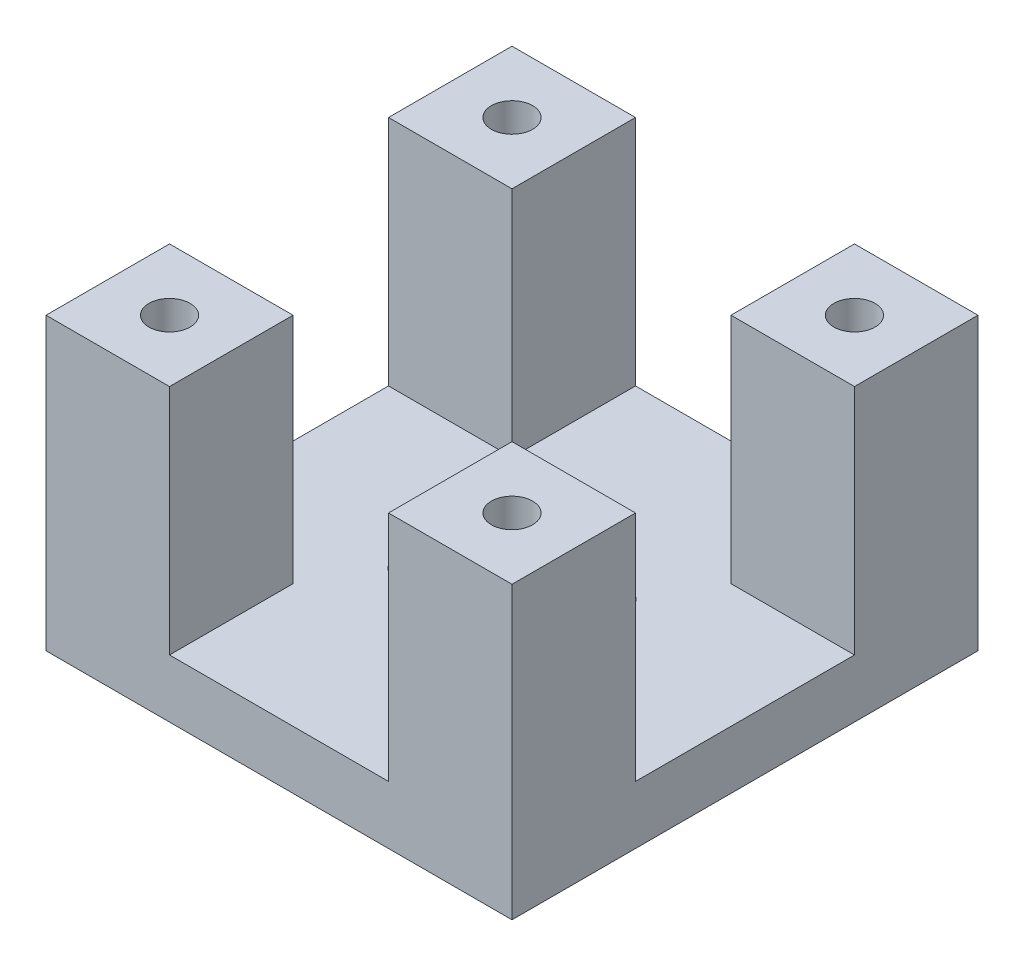
ISO-10303-21;
HEADER;
FILE_DESCRIPTION(('STEP AP214'),'2;1');
FILE_NAME('part.step','',(''),(''),'','','');
FILE_SCHEMA(('AUTOMOTIVE_DESIGN { 1 0 10303 214 1 1 1 1 }'));
ENDSEC;
DATA;
#1=APPLICATION_CONTEXT('core data for automotive mechanical design processes');
#2=APPLICATION_PROTOCOL_DEFINITION('international standard','automotive_design',2000,#1);
#3=PRODUCT_CONTEXT('',#1,'mechanical');
#4=PRODUCT('Part','Part','',(#3));
#5=PRODUCT_RELATED_PRODUCT_CATEGORY('part','',(#4));
#6=PRODUCT_DEFINITION_FORMATION('','',#4);
#7=PRODUCT_DEFINITION_CONTEXT('part definition',#1,'design');
#8=PRODUCT_DEFINITION('design','',#6,#7);
#9=PRODUCT_DEFINITION_SHAPE('','',#8);
#10=(LENGTH_UNIT() NAMED_UNIT(*) SI_UNIT(.MILLI.,.METRE.));
#11=(NAMED_UNIT(*) PLANE_ANGLE_UNIT() SI_UNIT($,.RADIAN.));
#12=(NAMED_UNIT(*) SI_UNIT($,.STERADIAN.) SOLID_ANGLE_UNIT());
#13=UNCERTAINTY_MEASURE_WITH_UNIT(LENGTH_MEASURE(1.E-05),#10,'distance_accuracy_value','');
#14=(GEOMETRIC_REPRESENTATION_CONTEXT(3) GLOBAL_UNCERTAINTY_ASSIGNED_CONTEXT((#13)) GLOBAL_UNIT_ASSIGNED_CONTEXT((#10,
#11,#12)) REPRESENTATION_CONTEXT('',''));
#15=CARTESIAN_POINT('',(0.,0.,0.));
#16=DIRECTION('',(0.,0.,1.));
#17=DIRECTION('',(1.,0.,0.));
#18=AXIS2_PLACEMENT_3D('',#15,#16,#17);
#19=CARTESIAN_POINT('',(-12.9903810567666,60.,-7.49999999999999));
#20=DIRECTION('',(0.,-1.,0.));
#21=DIRECTION('',(0.,0.,-1.));
#22=AXIS2_PLACEMENT_3D('',#19,#20,#21);
#23=CYLINDRICAL_SURFACE('',#22,2.);
#24=CARTESIAN_POINT('',(-12.9903810567666,0.,-7.49999999999999));
#25=DIRECTION('',(0.,1.,0.));
#26=DIRECTION('',(0.,0.,1.));
#27=AXIS2_PLACEMENT_3D('',#24,#25,#26);
#28=CIRCLE('',#27,2.);
#29=CARTESIAN_POINT('',(-12.9903810567666,0.,-5.49999999999999));
#30=VERTEX_POINT('',#29);
#31=EDGE_CURVE('E278',#30,#30,#28,.T.);
#32=ORIENTED_EDGE('',*,*,#31,.F.);
#33=EDGE_LOOP('',(#32));
#34=FACE_BOUND('',#33,.T.);
#35=CARTESIAN_POINT('',(-12.9903810567666,6.,-7.49999999999999));
#36=DIRECTION('',(0.,1.,0.));
#37=DIRECTION('',(0.,0.,1.));
#38=AXIS2_PLACEMENT_3D('',#35,#36,#37);
#39=CIRCLE('',#38,2.);
#40=CARTESIAN_POINT('',(-12.9903810567666,6.,-5.49999999999999));
#41=VERTEX_POINT('',#40);
#42=EDGE_CURVE('E41',#41,#41,#39,.T.);
#43=ORIENTED_EDGE('',*,*,#42,.T.);
#44=EDGE_LOOP('',(#43));
#45=FACE_BOUND('',#44,.T.);
#46=ADVANCED_FACE('F37',(#34,#45),#23,.F.);
#47=CARTESIAN_POINT('',(-12.9903810567666,60.,7.50000000000001));
#48=DIRECTION('',(0.,-1.,0.));
#49=DIRECTION('',(0.,0.,-1.));
#50=AXIS2_PLACEMENT_3D('',#47,#48,#49);
#51=CYLINDRICAL_SURFACE('',#50,2.);
#52=CARTESIAN_POINT('',(-12.9903810567666,0.,7.50000000000001));
#53=DIRECTION('',(0.,1.,0.));
#54=DIRECTION('',(0.,0.,1.));
#55=AXIS2_PLACEMENT_3D('',#52,#53,#54);
#56=CIRCLE('',#55,2.);
#57=CARTESIAN_POINT('',(-12.9903810567666,0.,9.50000000000001));
#58=VERTEX_POINT('',#57);
#59=EDGE_CURVE('E283',#58,#58,#56,.T.);
#60=ORIENTED_EDGE('',*,*,#59,.F.);
#61=EDGE_LOOP('',(#60));
#62=FACE_BOUND('',#61,.T.);
#63=CARTESIAN_POINT('',(-12.9903810567666,6.,7.50000000000001));
#64=DIRECTION('',(0.,1.,0.));
#65=DIRECTION('',(0.,0.,1.));
#66=AXIS2_PLACEMENT_3D('',#63,#64,#65);
#67=CIRCLE('',#66,2.);
#68=CARTESIAN_POINT('',(-12.9903810567666,6.,9.50000000000001));
#69=VERTEX_POINT('',#68);
#70=EDGE_CURVE('E362',#69,#69,#67,.T.);
#71=ORIENTED_EDGE('',*,*,#70,.T.);
#72=EDGE_LOOP('',(#71));
#73=FACE_BOUND('',#72,.T.);
#74=ADVANCED_FACE('F402',(#62,#73),#51,.F.);
#75=CARTESIAN_POINT('',(0.,60.,15.));
#76=DIRECTION('',(0.,-1.,0.));
#77=DIRECTION('',(0.,0.,-1.));
#78=AXIS2_PLACEMENT_3D('',#75,#76,#77);
#79=CYLINDRICAL_SURFACE('',#78,2.);
#80=CARTESIAN_POINT('',(0.,0.,15.));
#81=DIRECTION('',(0.,1.,0.));
#82=DIRECTION('',(0.,0.,1.));
#83=AXIS2_PLACEMENT_3D('',#80,#81,#82);
#84=CIRCLE('',#83,2.);
#85=CARTESIAN_POINT('',(0.,0.,17.));
#86=VERTEX_POINT('',#85);
#87=EDGE_CURVE('E286',#86,#86,#84,.T.);
#88=ORIENTED_EDGE('',*,*,#87,.F.);
#89=EDGE_LOOP('',(#88));
#90=FACE_BOUND('',#89,.T.);
#91=CARTESIAN_POINT('',(0.,6.,15.));
#92=DIRECTION('',(0.,1.,0.));
#93=DIRECTION('',(0.,0.,1.));
#94=AXIS2_PLACEMENT_3D('',#91,#92,#93);
#95=CIRCLE('',#94,2.);
#96=CARTESIAN_POINT('',(0.,6.,17.));
#97=VERTEX_POINT('',#96);
#98=EDGE_CURVE('E355',#97,#97,#95,.T.);
#99=ORIENTED_EDGE('',*,*,#98,.T.);
#100=EDGE_LOOP('',(#99));
#101=FACE_BOUND('',#100,.T.);
#102=ADVANCED_FACE('F408',(#90,#101),#79,.F.);
#103=CARTESIAN_POINT('',(12.9903810567666,60.,7.5));
#104=DIRECTION('',(0.,-1.,0.));
#105=DIRECTION('',(0.,0.,-1.));
#106=AXIS2_PLACEMENT_3D('',#103,#104,#105);
#107=CYLINDRICAL_SURFACE('',#106,2.);
#108=CARTESIAN_POINT('',(12.9903810567666,0.,7.5));
#109=DIRECTION('',(0.,1.,0.));
#110=DIRECTION('',(0.,0.,1.));
#111=AXIS2_PLACEMENT_3D('',#108,#109,#110);
#112=CIRCLE('',#111,2.);
#113=CARTESIAN_POINT('',(12.9903810567666,0.,9.5));
#114=VERTEX_POINT('',#113);
#115=EDGE_CURVE('E289',#114,#114,#112,.T.);
#116=ORIENTED_EDGE('',*,*,#115,.F.);
#117=EDGE_LOOP('',(#116));
#118=FACE_BOUND('',#117,.T.);
#119=CARTESIAN_POINT('',(12.9903810567666,6.,7.5));
#120=DIRECTION('',(0.,1.,0.));
#121=DIRECTION('',(0.,0.,1.));
#122=AXIS2_PLACEMENT_3D('',#119,#120,#121);
#123=CIRCLE('',#122,2.);
#124=CARTESIAN_POINT('',(12.9903810567666,6.,9.5));
#125=VERTEX_POINT('',#124);
#126=EDGE_CURVE('E348',#125,#125,#123,.T.);
#127=ORIENTED_EDGE('',*,*,#126,.T.);
#128=EDGE_LOOP('',(#127));
#129=FACE_BOUND('',#128,.T.);
#130=ADVANCED_FACE('F419',(#118,#129),#107,.F.);
#131=CARTESIAN_POINT('',(0.,60.,-15.));
#132=DIRECTION('',(0.,-1.,0.));
#133=DIRECTION('',(0.,0.,-1.));
#134=AXIS2_PLACEMENT_3D('',#131,#132,#133);
#135=CYLINDRICAL_SURFACE('',#134,2.);
#136=CARTESIAN_POINT('',(0.,0.,-15.));
#137=DIRECTION('',(0.,1.,0.));
#138=DIRECTION('',(0.,0.,1.));
#139=AXIS2_PLACEMENT_3D('',#136,#137,#138);
#140=CIRCLE('',#139,2.);
#141=CARTESIAN_POINT('',(0.,0.,-13.));
#142=VERTEX_POINT('',#141);
#143=EDGE_CURVE('E299',#142,#142,#140,.T.);
#144=ORIENTED_EDGE('',*,*,#143,.F.);
#145=EDGE_LOOP('',(#144));
#146=FACE_BOUND('',#145,.T.);
#147=CARTESIAN_POINT('',(0.,6.,-15.));
#148=DIRECTION('',(0.,1.,0.));
#149=DIRECTION('',(0.,0.,1.));
#150=AXIS2_PLACEMENT_3D('',#147,#148,#149);
#151=CIRCLE('',#150,2.);
#152=CARTESIAN_POINT('',(0.,6.,-13.));
#153=VERTEX_POINT('',#152);
#154=EDGE_CURVE('E341',#153,#153,#151,.T.);
#155=ORIENTED_EDGE('',*,*,#154,.T.);
#156=EDGE_LOOP('',(#155));
#157=FACE_BOUND('',#156,.T.);
#158=ADVANCED_FACE('F423',(#146,#157),#135,.F.);
#159=CARTESIAN_POINT('',(12.9903810567666,60.,-7.5));
#160=DIRECTION('',(0.,-1.,0.));
#161=DIRECTION('',(0.,0.,-1.));
#162=AXIS2_PLACEMENT_3D('',#159,#160,#161);
#163=CYLINDRICAL_SURFACE('',#162,2.);
#164=CARTESIAN_POINT('',(12.9903810567666,0.,-7.5));
#165=DIRECTION('',(0.,1.,0.));
#166=DIRECTION('',(0.,0.,1.));
#167=AXIS2_PLACEMENT_3D('',#164,#165,#166);
#168=CIRCLE('',#167,2.);
#169=CARTESIAN_POINT('',(12.9903810567666,0.,-5.5));
#170=VERTEX_POINT('',#169);
#171=EDGE_CURVE('E292',#170,#170,#168,.T.);
#172=ORIENTED_EDGE('',*,*,#171,.F.);
#173=EDGE_LOOP('',(#172));
#174=FACE_BOUND('',#173,.T.);
#175=CARTESIAN_POINT('',(12.9903810567666,6.,-7.5));
#176=DIRECTION('',(0.,1.,0.));
#177=DIRECTION('',(0.,0.,1.));
#178=AXIS2_PLACEMENT_3D('',#175,#176,#177);
#179=CIRCLE('',#178,2.);
#180=CARTESIAN_POINT('',(12.9903810567666,6.,-5.5));
#181=VERTEX_POINT('',#180);
#182=EDGE_CURVE('E221',#181,#181,#179,.T.);
#183=ORIENTED_EDGE('',*,*,#182,.T.);
#184=EDGE_LOOP('',(#183));
#185=FACE_BOUND('',#184,.T.);
#186=ADVANCED_FACE('F425',(#174,#185),#163,.F.);
#187=CARTESIAN_POINT('',(0.,60.,0.));
#188=DIRECTION('',(0.,1.,0.));
#189=DIRECTION('',(0.,0.,1.));
#190=AXIS2_PLACEMENT_3D('',#187,#188,#189);
#191=PLANE('',#190);
#192=DIRECTION('',(0.,0.,-1.));
#193=VECTOR('',#192,1.);
#194=CARTESIAN_POINT('',(22.6053390593274,60.,-48.1053390593274));
#195=LINE('',#194,#193);
#196=CARTESIAN_POINT('',(22.6053390593274,60.,-22.6053390593274));
#197=VERTEX_POINT('',#196);
#198=CARTESIAN_POINT('',(22.6053390593274,60.,-48.1053390593274));
#199=VERTEX_POINT('',#198);
#200=EDGE_CURVE('E188',#197,#199,#195,.T.);
#201=ORIENTED_EDGE('',*,*,#200,.F.);
#202=DIRECTION('',(-1.,0.,0.));
#203=VECTOR('',#202,1.);
#204=CARTESIAN_POINT('',(22.6053390593274,60.,-22.6053390593274));
#205=LINE('',#204,#203);
#206=CARTESIAN_POINT('',(48.1053390593273,60.,-22.6053390593274));
#207=VERTEX_POINT('',#206);
#208=EDGE_CURVE('E190',#207,#197,#205,.T.);
#209=ORIENTED_EDGE('',*,*,#208,.F.);
#210=DIRECTION('',(0.,0.,-1.));
#211=VECTOR('',#210,1.);
#212=CARTESIAN_POINT('',(48.1053390593273,60.,-48.1053390593274));
#213=LINE('',#212,#211);
#214=CARTESIAN_POINT('',(48.1053390593273,60.,-48.1053390593274));
#215=VERTEX_POINT('',#214);
#216=EDGE_CURVE('E313',#207,#215,#213,.T.);
#217=ORIENTED_EDGE('',*,*,#216,.T.);
#218=DIRECTION('',(-1.,0.,0.));
#219=VECTOR('',#218,1.);
#220=CARTESIAN_POINT('',(-48.1053390593273,60.,-48.1053390593274));
#221=LINE('',#220,#219);
#222=EDGE_CURVE('E317',#215,#199,#221,.T.);
#223=ORIENTED_EDGE('',*,*,#222,.T.);
#224=EDGE_LOOP('',(#201,#209,#217,#223));
#225=FACE_BOUND('',#224,.T.);
#226=CARTESIAN_POINT('',(35.3553390593274,60.,-35.3553390593273));
#227=DIRECTION('',(0.,1.,0.));
#228=DIRECTION('',(0.,0.,1.));
#229=AXIS2_PLACEMENT_3D('',#226,#227,#228);
#230=CIRCLE('',#229,4.25000000000004);
#231=CARTESIAN_POINT('',(35.3553390593274,60.,-31.1053390593273));
#232=VERTEX_POINT('',#231);
#233=EDGE_CURVE('E296',#232,#232,#230,.T.);
#234=ORIENTED_EDGE('',*,*,#233,.F.);
#235=EDGE_LOOP('',(#234));
#236=FACE_BOUND('',#235,.T.);
#237=ADVANCED_FACE('F428',(#225,#236),#191,.T.);
#238=DIRECTION('',(1.,0.,0.));
#239=VECTOR('',#238,1.);
#240=CARTESIAN_POINT('',(22.6053390593274,60.,22.6053390593274));
#241=LINE('',#240,#239);
#242=CARTESIAN_POINT('',(22.6053390593274,60.,22.6053390593274));
#243=VERTEX_POINT('',#242);
#244=CARTESIAN_POINT('',(48.1053390593273,60.,22.6053390593274));
#245=VERTEX_POINT('',#244);
#246=EDGE_CURVE('E231',#243,#245,#241,.T.);
#247=ORIENTED_EDGE('',*,*,#246,.F.);
#248=DIRECTION('',(0.,0.,-1.));
#249=VECTOR('',#248,1.);
#250=CARTESIAN_POINT('',(22.6053390593274,60.,22.6053390593274));
#251=LINE('',#250,#249);
#252=CARTESIAN_POINT('',(22.6053390593274,60.,48.1053390593274));
#253=VERTEX_POINT('',#252);
#254=EDGE_CURVE('E228',#253,#243,#251,.T.);
#255=ORIENTED_EDGE('',*,*,#254,.F.);
#256=DIRECTION('',(1.,0.,0.));
#257=VECTOR('',#256,1.);
#258=CARTESIAN_POINT('',(-48.1053390593273,60.,48.1053390593274));
#259=LINE('',#258,#257);
#260=CARTESIAN_POINT('',(48.1053390593273,60.,48.1053390593274));
#261=VERTEX_POINT('',#260);
#262=EDGE_CURVE('E310',#253,#261,#259,.T.);
#263=ORIENTED_EDGE('',*,*,#262,.T.);
#264=EDGE_CURVE('E314',#261,#245,#213,.T.);
#265=ORIENTED_EDGE('',*,*,#264,.T.);
#266=EDGE_LOOP('',(#247,#255,#263,#265));
#267=FACE_BOUND('',#266,.T.);
#268=CARTESIAN_POINT('',(35.3553390593273,60.,35.3553390593274));
#269=DIRECTION('',(0.,1.,0.));
#270=DIRECTION('',(0.,0.,1.));
#271=AXIS2_PLACEMENT_3D('',#268,#269,#270);
#272=CIRCLE('',#271,4.25000000000011);
#273=CARTESIAN_POINT('',(35.3553390593273,60.,39.6053390593275));
#274=VERTEX_POINT('',#273);
#275=EDGE_CURVE('E275',#274,#274,#272,.T.);
#276=ORIENTED_EDGE('',*,*,#275,.F.);
#277=EDGE_LOOP('',(#276));
#278=FACE_BOUND('',#277,.T.);
#279=ADVANCED_FACE('F470',(#267,#278),#191,.T.);
#280=DIRECTION('',(0.,0.,1.));
#281=VECTOR('',#280,1.);
#282=CARTESIAN_POINT('',(-22.6053390593274,60.,22.6053390593274));
#283=LINE('',#282,#281);
#284=CARTESIAN_POINT('',(-22.6053390593274,60.,22.6053390593274));
#285=VERTEX_POINT('',#284);
#286=CARTESIAN_POINT('',(-22.6053390593274,60.,48.1053390593274));
#287=VERTEX_POINT('',#286);
#288=EDGE_CURVE('E226',#285,#287,#283,.T.);
#289=ORIENTED_EDGE('',*,*,#288,.F.);
#290=DIRECTION('',(1.,0.,0.));
#291=VECTOR('',#290,1.);
#292=CARTESIAN_POINT('',(-48.1053390593274,60.,22.6053390593274));
#293=LINE('',#292,#291);
#294=CARTESIAN_POINT('',(-48.1053390593274,60.,22.6053390593274));
#295=VERTEX_POINT('',#294);
#296=EDGE_CURVE('E223',#295,#285,#293,.T.);
#297=ORIENTED_EDGE('',*,*,#296,.F.);
#298=DIRECTION('',(0.,0.,1.));
#299=VECTOR('',#298,1.);
#300=CARTESIAN_POINT('',(-48.1053390593273,60.,-48.1053390593274));
#301=LINE('',#300,#299);
#302=CARTESIAN_POINT('',(-48.1053390593273,60.,48.1053390593274));
#303=VERTEX_POINT('',#302);
#304=EDGE_CURVE('E93',#295,#303,#301,.T.);
#305=ORIENTED_EDGE('',*,*,#304,.T.);
#306=EDGE_CURVE('E311',#303,#287,#259,.T.);
#307=ORIENTED_EDGE('',*,*,#306,.T.);
#308=EDGE_LOOP('',(#289,#297,#305,#307));
#309=FACE_BOUND('',#308,.T.);
#310=CARTESIAN_POINT('',(-35.3553390593274,60.,35.3553390593273));
#311=DIRECTION('',(0.,1.,0.));
#312=DIRECTION('',(0.,0.,1.));
#313=AXIS2_PLACEMENT_3D('',#310,#311,#312);
#314=CIRCLE('',#313,4.25000000000017);
#315=CARTESIAN_POINT('',(-35.3553390593274,60.,39.6053390593275));
#316=VERTEX_POINT('',#315);
#317=EDGE_CURVE('E269',#316,#316,#314,.T.);
#318=ORIENTED_EDGE('',*,*,#317,.F.);
#319=EDGE_LOOP('',(#318));
#320=FACE_BOUND('',#319,.T.);
#321=ADVANCED_FACE('F442',(#309,#320),#191,.T.);
#322=CARTESIAN_POINT('',(0.,60.,0.));
#323=DIRECTION('',(0.,-1.,0.));
#324=DIRECTION('',(0.,0.,-1.));
#325=AXIS2_PLACEMENT_3D('',#322,#323,#324);
#326=CYLINDRICAL_SURFACE('',#325,11.);
#327=CARTESIAN_POINT('',(0.,0.,0.));
#328=DIRECTION('',(0.,1.,0.));
#329=DIRECTION('',(0.,0.,1.));
#330=AXIS2_PLACEMENT_3D('',#327,#328,#329);
#331=CIRCLE('',#330,11.);
#332=CARTESIAN_POINT('',(0.,0.,11.));
#333=VERTEX_POINT('',#332);
#334=EDGE_CURVE('E304',#333,#333,#331,.T.);
#335=ORIENTED_EDGE('',*,*,#334,.F.);
#336=EDGE_LOOP('',(#335));
#337=FACE_BOUND('',#336,.T.);
#338=CARTESIAN_POINT('',(0.,12.,0.));
#339=DIRECTION('',(0.,1.,0.));
#340=DIRECTION('',(0.,0.,1.));
#341=AXIS2_PLACEMENT_3D('',#338,#339,#340);
#342=CIRCLE('',#341,11.);
#343=CARTESIAN_POINT('',(0.,12.,11.));
#344=VERTEX_POINT('',#343);
#345=EDGE_CURVE('E237',#344,#344,#342,.T.);
#346=ORIENTED_EDGE('',*,*,#345,.T.);
#347=EDGE_LOOP('',(#346));
#348=FACE_BOUND('',#347,.T.);
#349=ADVANCED_FACE('F438',(#337,#348),#326,.F.);
#350=DIRECTION('',(0.,0.,1.));
#351=VECTOR('',#350,1.);
#352=CARTESIAN_POINT('',(-22.6053390593274,60.,-48.1053390593274));
#353=LINE('',#352,#351);
#354=CARTESIAN_POINT('',(-22.6053390593274,60.,-48.1053390593274));
#355=VERTEX_POINT('',#354);
#356=CARTESIAN_POINT('',(-22.6053390593274,60.,-22.6053390593274));
#357=VERTEX_POINT('',#356);
#358=EDGE_CURVE('E171',#355,#357,#353,.T.);
#359=ORIENTED_EDGE('',*,*,#358,.F.);
#360=CARTESIAN_POINT('',(-48.1053390593273,60.,-48.1053390593274));
#361=VERTEX_POINT('',#360);
#362=EDGE_CURVE('E63',#355,#361,#221,.T.);
#363=ORIENTED_EDGE('',*,*,#362,.T.);
#364=CARTESIAN_POINT('',(-48.1053390593274,60.,-22.6053390593274));
#365=VERTEX_POINT('',#364);
#366=EDGE_CURVE('E308',#361,#365,#301,.T.);
#367=ORIENTED_EDGE('',*,*,#366,.T.);
#368=DIRECTION('',(-1.,0.,0.));
#369=VECTOR('',#368,1.);
#370=CARTESIAN_POINT('',(-48.1053390593274,60.,-22.6053390593274));
#371=LINE('',#370,#369);
#372=EDGE_CURVE('E220',#357,#365,#371,.T.);
#373=ORIENTED_EDGE('',*,*,#372,.F.);
#374=EDGE_LOOP('',(#359,#363,#367,#373));
#375=FACE_BOUND('',#374,.T.);
#376=CARTESIAN_POINT('',(-35.3553390593273,60.,-35.3553390593274));
#377=DIRECTION('',(0.,1.,0.));
#378=DIRECTION('',(0.,0.,1.));
#379=AXIS2_PLACEMENT_3D('',#376,#377,#378);
#380=CIRCLE('',#379,4.25000000000025);
#381=CARTESIAN_POINT('',(-35.3553390593273,60.,-31.1053390593272));
#382=VERTEX_POINT('',#381);
#383=EDGE_CURVE('E263',#382,#382,#380,.T.);
#384=ORIENTED_EDGE('',*,*,#383,.F.);
#385=EDGE_LOOP('',(#384));
#386=FACE_BOUND('',#385,.T.);
#387=ADVANCED_FACE('F441',(#375,#386),#191,.T.);
#388=CARTESIAN_POINT('',(0.,0.,0.));
#389=DIRECTION('',(0.,1.,0.));
#390=DIRECTION('',(0.,0.,1.));
#391=AXIS2_PLACEMENT_3D('',#388,#389,#390);
#392=PLANE('',#391);
#393=DIRECTION('',(0.,0.,1.));
#394=VECTOR('',#393,1.);
#395=CARTESIAN_POINT('',(-48.1053390593273,0.,-48.1053390593274));
#396=LINE('',#395,#394);
#397=CARTESIAN_POINT('',(-48.1053390593273,0.,-48.1053390593274));
#398=VERTEX_POINT('',#397);
#399=CARTESIAN_POINT('',(-48.1053390593273,0.,48.1053390593274));
#400=VERTEX_POINT('',#399);
#401=EDGE_CURVE('E307',#398,#400,#396,.T.);
#402=ORIENTED_EDGE('',*,*,#401,.F.);
#403=DIRECTION('',(-1.,0.,0.));
#404=VECTOR('',#403,1.);
#405=CARTESIAN_POINT('',(-48.1053390593273,0.,-48.1053390593274));
#406=LINE('',#405,#404);
#407=CARTESIAN_POINT('',(48.1053390593273,0.,-48.1053390593274));
#408=VERTEX_POINT('',#407);
#409=EDGE_CURVE('E85',#408,#398,#406,.T.);
#410=ORIENTED_EDGE('',*,*,#409,.F.);
#411=DIRECTION('',(0.,0.,-1.));
#412=VECTOR('',#411,1.);
#413=CARTESIAN_POINT('',(48.1053390593273,0.,-48.1053390593274));
#414=LINE('',#413,#412);
#415=CARTESIAN_POINT('',(48.1053390593273,0.,48.1053390593274));
#416=VERTEX_POINT('',#415);
#417=EDGE_CURVE('E325',#416,#408,#414,.T.);
#418=ORIENTED_EDGE('',*,*,#417,.F.);
#419=DIRECTION('',(1.,0.,0.));
#420=VECTOR('',#419,1.);
#421=CARTESIAN_POINT('',(-48.1053390593273,0.,48.1053390593274));
#422=LINE('',#421,#420);
#423=EDGE_CURVE('E323',#400,#416,#422,.T.);
#424=ORIENTED_EDGE('',*,*,#423,.F.);
#425=EDGE_LOOP('',(#402,#410,#418,#424));
#426=FACE_BOUND('',#425,.T.);
#427=ORIENTED_EDGE('',*,*,#334,.T.);
#428=EDGE_LOOP('',(#427));
#429=FACE_BOUND('',#428,.T.);
#430=ORIENTED_EDGE('',*,*,#143,.T.);
#431=EDGE_LOOP('',(#430));
#432=FACE_BOUND('',#431,.T.);
#433=CARTESIAN_POINT('',(35.3553390593274,0.,-35.3553390593273));
#434=DIRECTION('',(0.,1.,0.));
#435=DIRECTION('',(0.,0.,1.));
#436=AXIS2_PLACEMENT_3D('',#433,#434,#435);
#437=CIRCLE('',#436,4.25000000000004);
#438=CARTESIAN_POINT('',(35.3553390593274,0.,-31.1053390593273));
#439=VERTEX_POINT('',#438);
#440=EDGE_CURVE('E295',#439,#439,#437,.T.);
#441=ORIENTED_EDGE('',*,*,#440,.T.);
#442=EDGE_LOOP('',(#441));
#443=FACE_BOUND('',#442,.T.);
#444=ORIENTED_EDGE('',*,*,#171,.T.);
#445=EDGE_LOOP('',(#444));
#446=FACE_BOUND('',#445,.T.);
#447=ORIENTED_EDGE('',*,*,#115,.T.);
#448=EDGE_LOOP('',(#447));
#449=FACE_BOUND('',#448,.T.);
#450=ORIENTED_EDGE('',*,*,#87,.T.);
#451=EDGE_LOOP('',(#450));
#452=FACE_BOUND('',#451,.T.);
#453=ORIENTED_EDGE('',*,*,#59,.T.);
#454=EDGE_LOOP('',(#453));
#455=FACE_BOUND('',#454,.T.);
#456=ORIENTED_EDGE('',*,*,#31,.T.);
#457=EDGE_LOOP('',(#456));
#458=FACE_BOUND('',#457,.T.);
#459=CARTESIAN_POINT('',(35.3553390593273,0.,35.3553390593274));
#460=DIRECTION('',(0.,1.,0.));
#461=DIRECTION('',(0.,0.,1.));
#462=AXIS2_PLACEMENT_3D('',#459,#460,#461);
#463=CIRCLE('',#462,4.25000000000011);
#464=CARTESIAN_POINT('',(35.3553390593273,0.,39.6053390593275));
#465=VERTEX_POINT('',#464);
#466=EDGE_CURVE('E272',#465,#465,#463,.T.);
#467=ORIENTED_EDGE('',*,*,#466,.T.);
#468=EDGE_LOOP('',(#467));
#469=FACE_BOUND('',#468,.T.);
#470=CARTESIAN_POINT('',(-35.3553390593274,0.,35.3553390593273));
#471=DIRECTION('',(0.,1.,0.));
#472=DIRECTION('',(0.,0.,1.));
#473=AXIS2_PLACEMENT_3D('',#470,#471,#472);
#474=CIRCLE('',#473,4.25000000000017);
#475=CARTESIAN_POINT('',(-35.3553390593274,0.,39.6053390593275));
#476=VERTEX_POINT('',#475);
#477=EDGE_CURVE('E266',#476,#476,#474,.T.);
#478=ORIENTED_EDGE('',*,*,#477,.T.);
#479=EDGE_LOOP('',(#478));
#480=FACE_BOUND('',#479,.T.);
#481=CARTESIAN_POINT('',(-35.3553390593273,0.,-35.3553390593274));
#482=DIRECTION('',(0.,1.,0.));
#483=DIRECTION('',(0.,0.,1.));
#484=AXIS2_PLACEMENT_3D('',#481,#482,#483);
#485=CIRCLE('',#484,4.25000000000025);
#486=CARTESIAN_POINT('',(-35.3553390593273,0.,-31.1053390593272));
#487=VERTEX_POINT('',#486);
#488=EDGE_CURVE('E262',#487,#487,#485,.T.);
#489=ORIENTED_EDGE('',*,*,#488,.T.);
#490=EDGE_LOOP('',(#489));
#491=FACE_BOUND('',#490,.T.);
#492=ADVANCED_FACE('F446',(#426,#429,#432,#443,#446,#449,#452,#455,#458,#469,#480,#491),#392,.F.);
#493=CARTESIAN_POINT('',(-48.1053390593273,60.,-48.1053390593274));
#494=DIRECTION('',(1.,0.,0.));
#495=DIRECTION('',(0.,0.,-1.));
#496=AXIS2_PLACEMENT_3D('',#493,#494,#495);
#497=PLANE('',#496);
#498=ORIENTED_EDGE('',*,*,#304,.F.);
#499=DIRECTION('',(0.,1.,0.));
#500=VECTOR('',#499,1.);
#501=CARTESIAN_POINT('',(-48.1053390593274,12.,22.6053390593274));
#502=LINE('',#501,#500);
#503=CARTESIAN_POINT('',(-48.1053390593274,12.,22.6053390593274));
#504=VERTEX_POINT('',#503);
#505=EDGE_CURVE('E257',#504,#295,#502,.T.);
#506=ORIENTED_EDGE('',*,*,#505,.F.);
#507=DIRECTION('',(0.,0.,1.));
#508=VECTOR('',#507,1.);
#509=CARTESIAN_POINT('',(-48.1053390593274,12.,-22.6053390593274));
#510=LINE('',#509,#508);
#511=CARTESIAN_POINT('',(-48.1053390593274,12.,-22.6053390593274));
#512=VERTEX_POINT('',#511);
#513=EDGE_CURVE('E183',#512,#504,#510,.T.);
#514=ORIENTED_EDGE('',*,*,#513,.F.);
#515=DIRECTION('',(0.,1.,0.));
#516=VECTOR('',#515,1.);
#517=CARTESIAN_POINT('',(-48.1053390593274,12.,-22.6053390593274));
#518=LINE('',#517,#516);
#519=EDGE_CURVE('E174',#512,#365,#518,.T.);
#520=ORIENTED_EDGE('',*,*,#519,.T.);
#521=ORIENTED_EDGE('',*,*,#366,.F.);
#522=DIRECTION('',(0.,-1.,0.));
#523=VECTOR('',#522,1.);
#524=CARTESIAN_POINT('',(-48.1053390593273,60.,-48.1053390593274));
#525=LINE('',#524,#523);
#526=EDGE_CURVE('E320',#361,#398,#525,.T.);
#527=ORIENTED_EDGE('',*,*,#526,.T.);
#528=ORIENTED_EDGE('',*,*,#401,.T.);
#529=DIRECTION('',(0.,-1.,0.));
#530=VECTOR('',#529,1.);
#531=CARTESIAN_POINT('',(-48.1053390593273,60.,48.1053390593274));
#532=LINE('',#531,#530);
#533=EDGE_CURVE('E11',#303,#400,#532,.T.);
#534=ORIENTED_EDGE('',*,*,#533,.F.);
#535=EDGE_LOOP('',(#498,#506,#514,#520,#521,#527,#528,#534));
#536=FACE_BOUND('',#535,.T.);
#537=ADVANCED_FACE('F39',(#536),#497,.F.);
#538=CARTESIAN_POINT('',(-48.1053390593273,60.,48.1053390593274));
#539=DIRECTION('',(0.,0.,-1.));
#540=DIRECTION('',(-1.,0.,0.));
#541=AXIS2_PLACEMENT_3D('',#538,#539,#540);
#542=PLANE('',#541);
#543=ORIENTED_EDGE('',*,*,#262,.F.);
#544=DIRECTION('',(0.,1.,0.));
#545=VECTOR('',#544,1.);
#546=CARTESIAN_POINT('',(22.6053390593274,12.,48.1053390593274));
#547=LINE('',#546,#545);
#548=CARTESIAN_POINT('',(22.6053390593274,12.,48.1053390593274));
#549=VERTEX_POINT('',#548);
#550=EDGE_CURVE('E250',#549,#253,#547,.T.);
#551=ORIENTED_EDGE('',*,*,#550,.F.);
#552=DIRECTION('',(1.,0.,0.));
#553=VECTOR('',#552,1.);
#554=CARTESIAN_POINT('',(-22.6053390593274,12.,48.1053390593274));
#555=LINE('',#554,#553);
#556=CARTESIAN_POINT('',(-22.6053390593274,12.,48.1053390593274));
#557=VERTEX_POINT('',#556);
#558=EDGE_CURVE('E203',#557,#549,#555,.T.);
#559=ORIENTED_EDGE('',*,*,#558,.F.);
#560=DIRECTION('',(0.,1.,0.));
#561=VECTOR('',#560,1.);
#562=CARTESIAN_POINT('',(-22.6053390593274,12.,48.1053390593274));
#563=LINE('',#562,#561);
#564=EDGE_CURVE('E252',#557,#287,#563,.T.);
#565=ORIENTED_EDGE('',*,*,#564,.T.);
#566=ORIENTED_EDGE('',*,*,#306,.F.);
#567=ORIENTED_EDGE('',*,*,#533,.T.);
#568=ORIENTED_EDGE('',*,*,#423,.T.);
#569=DIRECTION('',(0.,-1.,0.));
#570=VECTOR('',#569,1.);
#571=CARTESIAN_POINT('',(48.1053390593273,60.,48.1053390593274));
#572=LINE('',#571,#570);
#573=EDGE_CURVE('E46',#261,#416,#572,.T.);
#574=ORIENTED_EDGE('',*,*,#573,.F.);
#575=EDGE_LOOP('',(#543,#551,#559,#565,#566,#567,#568,#574));
#576=FACE_BOUND('',#575,.T.);
#577=ADVANCED_FACE('F454',(#576),#542,.F.);
#578=CARTESIAN_POINT('',(48.1053390593273,60.,-48.1053390593274));
#579=DIRECTION('',(-1.,0.,0.));
#580=DIRECTION('',(0.,0.,1.));
#581=AXIS2_PLACEMENT_3D('',#578,#579,#580);
#582=PLANE('',#581);
#583=ORIENTED_EDGE('',*,*,#216,.F.);
#584=DIRECTION('',(0.,1.,0.));
#585=VECTOR('',#584,1.);
#586=CARTESIAN_POINT('',(48.1053390593273,12.,-22.6053390593274));
#587=LINE('',#586,#585);
#588=CARTESIAN_POINT('',(48.1053390593273,12.,-22.6053390593274));
#589=VERTEX_POINT('',#588);
#590=EDGE_CURVE('E243',#589,#207,#587,.T.);
#591=ORIENTED_EDGE('',*,*,#590,.F.);
#592=DIRECTION('',(0.,0.,-1.));
#593=VECTOR('',#592,1.);
#594=CARTESIAN_POINT('',(48.1053390593273,12.,-22.6053390593274));
#595=LINE('',#594,#593);
#596=CARTESIAN_POINT('',(48.1053390593273,12.,22.6053390593274));
#597=VERTEX_POINT('',#596);
#598=EDGE_CURVE('E212',#597,#589,#595,.T.);
#599=ORIENTED_EDGE('',*,*,#598,.F.);
#600=DIRECTION('',(0.,1.,0.));
#601=VECTOR('',#600,1.);
#602=CARTESIAN_POINT('',(48.1053390593273,12.,22.6053390593274));
#603=LINE('',#602,#601);
#604=EDGE_CURVE('E245',#597,#245,#603,.T.);
#605=ORIENTED_EDGE('',*,*,#604,.T.);
#606=ORIENTED_EDGE('',*,*,#264,.F.);
#607=ORIENTED_EDGE('',*,*,#573,.T.);
#608=ORIENTED_EDGE('',*,*,#417,.T.);
#609=DIRECTION('',(0.,-1.,0.));
#610=VECTOR('',#609,1.);
#611=CARTESIAN_POINT('',(48.1053390593273,60.,-48.1053390593274));
#612=LINE('',#611,#610);
#613=EDGE_CURVE('E329',#215,#408,#612,.T.);
#614=ORIENTED_EDGE('',*,*,#613,.F.);
#615=EDGE_LOOP('',(#583,#591,#599,#605,#606,#607,#608,#614));
#616=FACE_BOUND('',#615,.T.);
#617=ADVANCED_FACE('F452',(#616),#582,.F.);
#618=CARTESIAN_POINT('',(-48.1053390593273,60.,-48.1053390593274));
#619=DIRECTION('',(0.,0.,1.));
#620=DIRECTION('',(1.,0.,0.));
#621=AXIS2_PLACEMENT_3D('',#618,#619,#620);
#622=PLANE('',#621);
#623=ORIENTED_EDGE('',*,*,#362,.F.);
#624=DIRECTION('',(0.,1.,0.));
#625=VECTOR('',#624,1.);
#626=CARTESIAN_POINT('',(-22.6053390593274,12.,-48.1053390593274));
#627=LINE('',#626,#625);
#628=CARTESIAN_POINT('',(-22.6053390593274,12.,-48.1053390593274));
#629=VERTEX_POINT('',#628);
#630=EDGE_CURVE('E235',#629,#355,#627,.T.);
#631=ORIENTED_EDGE('',*,*,#630,.F.);
#632=DIRECTION('',(-1.,0.,0.));
#633=VECTOR('',#632,1.);
#634=CARTESIAN_POINT('',(-22.6053390593274,12.,-48.1053390593274));
#635=LINE('',#634,#633);
#636=CARTESIAN_POINT('',(22.6053390593274,12.,-48.1053390593274));
#637=VERTEX_POINT('',#636);
#638=EDGE_CURVE('E175',#637,#629,#635,.T.);
#639=ORIENTED_EDGE('',*,*,#638,.F.);
#640=DIRECTION('',(0.,1.,0.));
#641=VECTOR('',#640,1.);
#642=CARTESIAN_POINT('',(22.6053390593274,12.,-48.1053390593274));
#643=LINE('',#642,#641);
#644=EDGE_CURVE('E238',#637,#199,#643,.T.);
#645=ORIENTED_EDGE('',*,*,#644,.T.);
#646=ORIENTED_EDGE('',*,*,#222,.F.);
#647=ORIENTED_EDGE('',*,*,#613,.T.);
#648=ORIENTED_EDGE('',*,*,#409,.T.);
#649=ORIENTED_EDGE('',*,*,#526,.F.);
#650=EDGE_LOOP('',(#623,#631,#639,#645,#646,#647,#648,#649));
#651=FACE_BOUND('',#650,.T.);
#652=ADVANCED_FACE('F433',(#651),#622,.F.);
#653=CARTESIAN_POINT('',(35.3553390593274,60.,-35.3553390593273));
#654=DIRECTION('',(0.,-1.,0.));
#655=DIRECTION('',(0.,0.,-1.));
#656=AXIS2_PLACEMENT_3D('',#653,#654,#655);
#657=CYLINDRICAL_SURFACE('',#656,4.25000000000004);
#658=ORIENTED_EDGE('',*,*,#233,.T.);
#659=EDGE_LOOP('',(#658));
#660=FACE_BOUND('',#659,.T.);
#661=ORIENTED_EDGE('',*,*,#440,.F.);
#662=EDGE_LOOP('',(#661));
#663=FACE_BOUND('',#662,.T.);
#664=ADVANCED_FACE('F430',(#660,#663),#657,.F.);
#665=CARTESIAN_POINT('',(35.3553390593273,60.,35.3553390593274));
#666=DIRECTION('',(0.,-1.,0.));
#667=DIRECTION('',(0.,0.,-1.));
#668=AXIS2_PLACEMENT_3D('',#665,#666,#667);
#669=CYLINDRICAL_SURFACE('',#668,4.25000000000011);
#670=ORIENTED_EDGE('',*,*,#275,.T.);
#671=EDGE_LOOP('',(#670));
#672=FACE_BOUND('',#671,.T.);
#673=ORIENTED_EDGE('',*,*,#466,.F.);
#674=EDGE_LOOP('',(#673));
#675=FACE_BOUND('',#674,.T.);
#676=ADVANCED_FACE('F414',(#672,#675),#669,.F.);
#677=CARTESIAN_POINT('',(-35.3553390593274,60.,35.3553390593273));
#678=DIRECTION('',(0.,-1.,0.));
#679=DIRECTION('',(0.,0.,-1.));
#680=AXIS2_PLACEMENT_3D('',#677,#678,#679);
#681=CYLINDRICAL_SURFACE('',#680,4.25000000000017);
#682=ORIENTED_EDGE('',*,*,#317,.T.);
#683=EDGE_LOOP('',(#682));
#684=FACE_BOUND('',#683,.T.);
#685=ORIENTED_EDGE('',*,*,#477,.F.);
#686=EDGE_LOOP('',(#685));
#687=FACE_BOUND('',#686,.T.);
#688=ADVANCED_FACE('F512',(#684,#687),#681,.F.);
#689=CARTESIAN_POINT('',(-35.3553390593273,60.,-35.3553390593274));
#690=DIRECTION('',(0.,-1.,0.));
#691=DIRECTION('',(0.,0.,-1.));
#692=AXIS2_PLACEMENT_3D('',#689,#690,#691);
#693=CYLINDRICAL_SURFACE('',#692,4.25000000000025);
#694=ORIENTED_EDGE('',*,*,#383,.T.);
#695=EDGE_LOOP('',(#694));
#696=FACE_BOUND('',#695,.T.);
#697=ORIENTED_EDGE('',*,*,#488,.F.);
#698=EDGE_LOOP('',(#697));
#699=FACE_BOUND('',#698,.T.);
#700=ADVANCED_FACE('F510',(#696,#699),#693,.F.);
#701=CARTESIAN_POINT('',(-22.6053390593274,12.,-48.1053390593274));
#702=DIRECTION('',(-1.,0.,0.));
#703=DIRECTION('',(0.,0.,1.));
#704=AXIS2_PLACEMENT_3D('',#701,#702,#703);
#705=PLANE('',#704);
#706=ORIENTED_EDGE('',*,*,#358,.T.);
#707=DIRECTION('',(0.,1.,0.));
#708=VECTOR('',#707,1.);
#709=CARTESIAN_POINT('',(-22.6053390593274,12.,-22.6053390593274));
#710=LINE('',#709,#708);
#711=CARTESIAN_POINT('',(-22.6053390593274,12.,-22.6053390593274));
#712=VERTEX_POINT('',#711);
#713=EDGE_CURVE('E166',#712,#357,#710,.T.);
#714=ORIENTED_EDGE('',*,*,#713,.F.);
#715=DIRECTION('',(0.,0.,1.));
#716=VECTOR('',#715,1.);
#717=CARTESIAN_POINT('',(-22.6053390593274,12.,-48.1053390593274));
#718=LINE('',#717,#716);
#719=EDGE_CURVE('E170',#629,#712,#718,.T.);
#720=ORIENTED_EDGE('',*,*,#719,.F.);
#721=ORIENTED_EDGE('',*,*,#630,.T.);
#722=EDGE_LOOP('',(#706,#714,#720,#721));
#723=FACE_BOUND('',#722,.T.);
#724=ADVANCED_FACE('F168',(#723),#705,.F.);
#725=CARTESIAN_POINT('',(22.6053390593274,12.,-48.1053390593274));
#726=DIRECTION('',(1.,0.,0.));
#727=DIRECTION('',(0.,0.,-1.));
#728=AXIS2_PLACEMENT_3D('',#725,#726,#727);
#729=PLANE('',#728);
#730=ORIENTED_EDGE('',*,*,#200,.T.);
#731=ORIENTED_EDGE('',*,*,#644,.F.);
#732=DIRECTION('',(0.,0.,-1.));
#733=VECTOR('',#732,1.);
#734=CARTESIAN_POINT('',(22.6053390593274,12.,-48.1053390593274));
#735=LINE('',#734,#733);
#736=CARTESIAN_POINT('',(22.6053390593274,12.,-22.6053390593274));
#737=VERTEX_POINT('',#736);
#738=EDGE_CURVE('E54',#737,#637,#735,.T.);
#739=ORIENTED_EDGE('',*,*,#738,.F.);
#740=DIRECTION('',(0.,1.,0.));
#741=VECTOR('',#740,1.);
#742=CARTESIAN_POINT('',(22.6053390593274,12.,-22.6053390593274));
#743=LINE('',#742,#741);
#744=EDGE_CURVE('E241',#737,#197,#743,.T.);
#745=ORIENTED_EDGE('',*,*,#744,.T.);
#746=EDGE_LOOP('',(#730,#731,#739,#745));
#747=FACE_BOUND('',#746,.T.);
#748=ADVANCED_FACE('F519',(#747),#729,.F.);
#749=CARTESIAN_POINT('',(22.6053390593274,12.,-22.6053390593274));
#750=DIRECTION('',(0.,0.,-1.));
#751=DIRECTION('',(-1.,0.,0.));
#752=AXIS2_PLACEMENT_3D('',#749,#750,#751);
#753=PLANE('',#752);
#754=ORIENTED_EDGE('',*,*,#208,.T.);
#755=ORIENTED_EDGE('',*,*,#744,.F.);
#756=DIRECTION('',(-1.,0.,0.));
#757=VECTOR('',#756,1.);
#758=CARTESIAN_POINT('',(22.6053390593274,12.,-22.6053390593274));
#759=LINE('',#758,#757);
#760=EDGE_CURVE('E215',#589,#737,#759,.T.);
#761=ORIENTED_EDGE('',*,*,#760,.F.);
#762=ORIENTED_EDGE('',*,*,#590,.T.);
#763=EDGE_LOOP('',(#754,#755,#761,#762));
#764=FACE_BOUND('',#763,.T.);
#765=ADVANCED_FACE('F534',(#764),#753,.F.);
#766=CARTESIAN_POINT('',(22.6053390593274,12.,22.6053390593274));
#767=DIRECTION('',(0.,0.,1.));
#768=DIRECTION('',(1.,0.,0.));
#769=AXIS2_PLACEMENT_3D('',#766,#767,#768);
#770=PLANE('',#769);
#771=ORIENTED_EDGE('',*,*,#246,.T.);
#772=ORIENTED_EDGE('',*,*,#604,.F.);
#773=DIRECTION('',(1.,0.,0.));
#774=VECTOR('',#773,1.);
#775=CARTESIAN_POINT('',(22.6053390593274,12.,22.6053390593274));
#776=LINE('',#775,#774);
#777=CARTESIAN_POINT('',(22.6053390593274,12.,22.6053390593274));
#778=VERTEX_POINT('',#777);
#779=EDGE_CURVE('E209',#778,#597,#776,.T.);
#780=ORIENTED_EDGE('',*,*,#779,.F.);
#781=DIRECTION('',(0.,1.,0.));
#782=VECTOR('',#781,1.);
#783=CARTESIAN_POINT('',(22.6053390593274,12.,22.6053390593274));
#784=LINE('',#783,#782);
#785=EDGE_CURVE('E248',#778,#243,#784,.T.);
#786=ORIENTED_EDGE('',*,*,#785,.T.);
#787=EDGE_LOOP('',(#771,#772,#780,#786));
#788=FACE_BOUND('',#787,.T.);
#789=ADVANCED_FACE('F531',(#788),#770,.F.);
#790=CARTESIAN_POINT('',(22.6053390593274,12.,22.6053390593274));
#791=DIRECTION('',(1.,0.,0.));
#792=DIRECTION('',(0.,0.,-1.));
#793=AXIS2_PLACEMENT_3D('',#790,#791,#792);
#794=PLANE('',#793);
#795=ORIENTED_EDGE('',*,*,#254,.T.);
#796=ORIENTED_EDGE('',*,*,#785,.F.);
#797=DIRECTION('',(0.,0.,-1.));
#798=VECTOR('',#797,1.);
#799=CARTESIAN_POINT('',(22.6053390593274,12.,22.6053390593274));
#800=LINE('',#799,#798);
#801=EDGE_CURVE('E206',#549,#778,#800,.T.);
#802=ORIENTED_EDGE('',*,*,#801,.F.);
#803=ORIENTED_EDGE('',*,*,#550,.T.);
#804=EDGE_LOOP('',(#795,#796,#802,#803));
#805=FACE_BOUND('',#804,.T.);
#806=ADVANCED_FACE('F473',(#805),#794,.F.);
#807=CARTESIAN_POINT('',(-22.6053390593274,12.,22.6053390593274));
#808=DIRECTION('',(-1.,0.,0.));
#809=DIRECTION('',(0.,0.,1.));
#810=AXIS2_PLACEMENT_3D('',#807,#808,#809);
#811=PLANE('',#810);
#812=ORIENTED_EDGE('',*,*,#288,.T.);
#813=ORIENTED_EDGE('',*,*,#564,.F.);
#814=DIRECTION('',(0.,0.,1.));
#815=VECTOR('',#814,1.);
#816=CARTESIAN_POINT('',(-22.6053390593274,12.,22.6053390593274));
#817=LINE('',#816,#815);
#818=CARTESIAN_POINT('',(-22.6053390593274,12.,22.6053390593274));
#819=VERTEX_POINT('',#818);
#820=EDGE_CURVE('E200',#819,#557,#817,.T.);
#821=ORIENTED_EDGE('',*,*,#820,.F.);
#822=DIRECTION('',(0.,1.,0.));
#823=VECTOR('',#822,1.);
#824=CARTESIAN_POINT('',(-22.6053390593274,12.,22.6053390593274));
#825=LINE('',#824,#823);
#826=EDGE_CURVE('E255',#819,#285,#825,.T.);
#827=ORIENTED_EDGE('',*,*,#826,.T.);
#828=EDGE_LOOP('',(#812,#813,#821,#827));
#829=FACE_BOUND('',#828,.T.);
#830=ADVANCED_FACE('F480',(#829),#811,.F.);
#831=CARTESIAN_POINT('',(-48.1053390593274,12.,22.6053390593274));
#832=DIRECTION('',(0.,0.,1.));
#833=DIRECTION('',(1.,0.,0.));
#834=AXIS2_PLACEMENT_3D('',#831,#832,#833);
#835=PLANE('',#834);
#836=ORIENTED_EDGE('',*,*,#296,.T.);
#837=ORIENTED_EDGE('',*,*,#826,.F.);
#838=DIRECTION('',(1.,0.,0.));
#839=VECTOR('',#838,1.);
#840=CARTESIAN_POINT('',(-48.1053390593274,12.,22.6053390593274));
#841=LINE('',#840,#839);
#842=EDGE_CURVE('E197',#504,#819,#841,.T.);
#843=ORIENTED_EDGE('',*,*,#842,.F.);
#844=ORIENTED_EDGE('',*,*,#505,.T.);
#845=EDGE_LOOP('',(#836,#837,#843,#844));
#846=FACE_BOUND('',#845,.T.);
#847=ADVANCED_FACE('F482',(#846),#835,.F.);
#848=CARTESIAN_POINT('',(-48.1053390593274,12.,-22.6053390593274));
#849=DIRECTION('',(0.,0.,-1.));
#850=DIRECTION('',(-1.,0.,0.));
#851=AXIS2_PLACEMENT_3D('',#848,#849,#850);
#852=PLANE('',#851);
#853=ORIENTED_EDGE('',*,*,#372,.T.);
#854=ORIENTED_EDGE('',*,*,#519,.F.);
#855=DIRECTION('',(-1.,0.,0.));
#856=VECTOR('',#855,1.);
#857=CARTESIAN_POINT('',(-48.1053390593274,12.,-22.6053390593274));
#858=LINE('',#857,#856);
#859=EDGE_CURVE('E178',#712,#512,#858,.T.);
#860=ORIENTED_EDGE('',*,*,#859,.F.);
#861=ORIENTED_EDGE('',*,*,#713,.T.);
#862=EDGE_LOOP('',(#853,#854,#860,#861));
#863=FACE_BOUND('',#862,.T.);
#864=ADVANCED_FACE('F179',(#863),#852,.F.);
#865=CARTESIAN_POINT('',(0.,12.,0.));
#866=DIRECTION('',(0.,1.,0.));
#867=DIRECTION('',(0.,0.,1.));
#868=AXIS2_PLACEMENT_3D('',#865,#866,#867);
#869=PLANE('',#868);
#870=CARTESIAN_POINT('',(-12.9903810567663,12.,-7.49999999999943));
#871=DIRECTION('',(0.,1.,0.));
#872=DIRECTION('',(0.,0.,1.));
#873=AXIS2_PLACEMENT_3D('',#870,#871,#872);
#874=CIRCLE('',#873,3.62500000000064);
#875=CARTESIAN_POINT('',(-12.9903810567663,12.,-3.87499999999878));
#876=VERTEX_POINT('',#875);
#877=EDGE_CURVE('E365',#876,#876,#874,.T.);
#878=ORIENTED_EDGE('',*,*,#877,.F.);
#879=EDGE_LOOP('',(#878));
#880=FACE_BOUND('',#879,.T.);
#881=CARTESIAN_POINT('',(-12.9903810567656,12.,7.50000000000057));
#882=DIRECTION('',(0.,1.,0.));
#883=DIRECTION('',(0.,0.,1.));
#884=AXIS2_PLACEMENT_3D('',#881,#882,#883);
#885=CIRCLE('',#884,3.62500000000121);
#886=CARTESIAN_POINT('',(-12.9903810567656,12.,11.1250000000018));
#887=VERTEX_POINT('',#886);
#888=EDGE_CURVE('E359',#887,#887,#885,.T.);
#889=ORIENTED_EDGE('',*,*,#888,.F.);
#890=EDGE_LOOP('',(#889));
#891=FACE_BOUND('',#890,.T.);
#892=CARTESIAN_POINT('',(1.28584404218965E-12,12.,15.));
#893=DIRECTION('',(0.,1.,0.));
#894=DIRECTION('',(0.,0.,1.));
#895=AXIS2_PLACEMENT_3D('',#892,#893,#894);
#896=CIRCLE('',#895,3.62500000000131);
#897=CARTESIAN_POINT('',(1.28584404218965E-12,12.,18.6250000000013));
#898=VERTEX_POINT('',#897);
#899=EDGE_CURVE('E352',#898,#898,#896,.T.);
#900=ORIENTED_EDGE('',*,*,#899,.F.);
#901=EDGE_LOOP('',(#900));
#902=FACE_BOUND('',#901,.T.);
#903=CARTESIAN_POINT('',(12.9903810567675,12.,7.49999999999943));
#904=DIRECTION('',(0.,1.,0.));
#905=DIRECTION('',(0.,0.,1.));
#906=AXIS2_PLACEMENT_3D('',#903,#904,#905);
#907=CIRCLE('',#906,3.62500000000082);
#908=CARTESIAN_POINT('',(12.9903810567675,12.,11.1250000000003));
#909=VERTEX_POINT('',#908);
#910=EDGE_CURVE('E345',#909,#909,#907,.T.);
#911=ORIENTED_EDGE('',*,*,#910,.F.);
#912=EDGE_LOOP('',(#911));
#913=FACE_BOUND('',#912,.T.);
#914=CARTESIAN_POINT('',(0.,12.,-15.));
#915=DIRECTION('',(0.,1.,0.));
#916=DIRECTION('',(0.,0.,1.));
#917=AXIS2_PLACEMENT_3D('',#914,#915,#916);
#918=CIRCLE('',#917,3.625);
#919=CARTESIAN_POINT('',(0.,12.,-11.375));
#920=VERTEX_POINT('',#919);
#921=EDGE_CURVE('E338',#920,#920,#918,.T.);
#922=ORIENTED_EDGE('',*,*,#921,.F.);
#923=EDGE_LOOP('',(#922));
#924=FACE_BOUND('',#923,.T.);
#925=CARTESIAN_POINT('',(12.9903810567669,12.,-7.50000000000056));
#926=DIRECTION('',(0.,1.,0.));
#927=DIRECTION('',(0.,0.,1.));
#928=AXIS2_PLACEMENT_3D('',#925,#926,#927);
#929=CIRCLE('',#928,3.62500000000018);
#930=CARTESIAN_POINT('',(12.9903810567669,12.,-3.87500000000039));
#931=VERTEX_POINT('',#930);
#932=EDGE_CURVE('E333',#931,#931,#929,.T.);
#933=ORIENTED_EDGE('',*,*,#932,.F.);
#934=EDGE_LOOP('',(#933));
#935=FACE_BOUND('',#934,.T.);
#936=ORIENTED_EDGE('',*,*,#345,.F.);
#937=EDGE_LOOP('',(#936));
#938=FACE_BOUND('',#937,.T.);
#939=ORIENTED_EDGE('',*,*,#719,.T.);
#940=ORIENTED_EDGE('',*,*,#859,.T.);
#941=ORIENTED_EDGE('',*,*,#513,.T.);
#942=ORIENTED_EDGE('',*,*,#842,.T.);
#943=ORIENTED_EDGE('',*,*,#820,.T.);
#944=ORIENTED_EDGE('',*,*,#558,.T.);
#945=ORIENTED_EDGE('',*,*,#801,.T.);
#946=ORIENTED_EDGE('',*,*,#779,.T.);
#947=ORIENTED_EDGE('',*,*,#598,.T.);
#948=ORIENTED_EDGE('',*,*,#760,.T.);
#949=ORIENTED_EDGE('',*,*,#738,.T.);
#950=ORIENTED_EDGE('',*,*,#638,.T.);
#951=EDGE_LOOP('',(#939,#940,#941,#942,#943,#944,#945,#946,#947,#948,#949,#950));
#952=FACE_BOUND('',#951,.T.);
#953=ADVANCED_FACE('F185',(#880,#891,#902,#913,#924,#935,#938,#952),#869,.T.);
#954=CARTESIAN_POINT('',(12.9903810567669,6.,-7.50000000000056));
#955=DIRECTION('',(0.,1.,0.));
#956=DIRECTION('',(0.,0.,1.));
#957=AXIS2_PLACEMENT_3D('',#954,#955,#956);
#958=CYLINDRICAL_SURFACE('',#957,3.62500000000018);
#959=ORIENTED_EDGE('',*,*,#932,.T.);
#960=EDGE_LOOP('',(#959));
#961=FACE_BOUND('',#960,.T.);
#962=CARTESIAN_POINT('',(12.9903810567669,6.,-7.50000000000056));
#963=DIRECTION('',(0.,1.,0.));
#964=DIRECTION('',(0.,0.,1.));
#965=AXIS2_PLACEMENT_3D('',#962,#963,#964);
#966=CIRCLE('',#965,3.62500000000018);
#967=CARTESIAN_POINT('',(12.9903810567669,6.,-3.87500000000039));
#968=VERTEX_POINT('',#967);
#969=EDGE_CURVE('E193',#968,#968,#966,.T.);
#970=ORIENTED_EDGE('',*,*,#969,.F.);
#971=EDGE_LOOP('',(#970));
#972=FACE_BOUND('',#971,.T.);
#973=ADVANCED_FACE('F398',(#961,#972),#958,.F.);
#974=CARTESIAN_POINT('',(12.9903810567669,6.,-7.50000000000056));
#975=DIRECTION('',(0.,1.,0.));
#976=DIRECTION('',(0.,0.,1.));
#977=AXIS2_PLACEMENT_3D('',#974,#975,#976);
#978=PLANE('',#977);
#979=ORIENTED_EDGE('',*,*,#182,.F.);
#980=EDGE_LOOP('',(#979));
#981=FACE_BOUND('',#980,.T.);
#982=ORIENTED_EDGE('',*,*,#969,.T.);
#983=EDGE_LOOP('',(#982));
#984=FACE_BOUND('',#983,.T.);
#985=ADVANCED_FACE('F388',(#981,#984),#978,.T.);
#986=CARTESIAN_POINT('',(0.,6.,-15.));
#987=DIRECTION('',(0.,1.,0.));
#988=DIRECTION('',(0.,0.,1.));
#989=AXIS2_PLACEMENT_3D('',#986,#987,#988);
#990=CYLINDRICAL_SURFACE('',#989,3.625);
#991=ORIENTED_EDGE('',*,*,#921,.T.);
#992=EDGE_LOOP('',(#991));
#993=FACE_BOUND('',#992,.T.);
#994=CARTESIAN_POINT('',(0.,6.,-15.));
#995=DIRECTION('',(0.,1.,0.));
#996=DIRECTION('',(0.,0.,1.));
#997=AXIS2_PLACEMENT_3D('',#994,#995,#996);
#998=CIRCLE('',#997,3.625);
#999=CARTESIAN_POINT('',(0.,6.,-11.375));
#1000=VERTEX_POINT('',#999);
#1001=EDGE_CURVE('E342',#1000,#1000,#998,.T.);
#1002=ORIENTED_EDGE('',*,*,#1001,.F.);
#1003=EDGE_LOOP('',(#1002));
#1004=FACE_BOUND('',#1003,.T.);
#1005=ADVANCED_FACE('F386',(#993,#1004),#990,.F.);
#1006=CARTESIAN_POINT('',(0.,6.,-15.));
#1007=DIRECTION('',(0.,1.,0.));
#1008=DIRECTION('',(0.,0.,1.));
#1009=AXIS2_PLACEMENT_3D('',#1006,#1007,#1008);
#1010=PLANE('',#1009);
#1011=ORIENTED_EDGE('',*,*,#154,.F.);
#1012=EDGE_LOOP('',(#1011));
#1013=FACE_BOUND('',#1012,.T.);
#1014=ORIENTED_EDGE('',*,*,#1001,.T.);
#1015=EDGE_LOOP('',(#1014));
#1016=FACE_BOUND('',#1015,.T.);
#1017=ADVANCED_FACE('F384',(#1013,#1016),#1010,.T.);
#1018=CARTESIAN_POINT('',(12.9903810567675,6.,7.49999999999943));
#1019=DIRECTION('',(0.,1.,0.));
#1020=DIRECTION('',(0.,0.,1.));
#1021=AXIS2_PLACEMENT_3D('',#1018,#1019,#1020);
#1022=CYLINDRICAL_SURFACE('',#1021,3.62500000000082);
#1023=ORIENTED_EDGE('',*,*,#910,.T.);
#1024=EDGE_LOOP('',(#1023));
#1025=FACE_BOUND('',#1024,.T.);
#1026=CARTESIAN_POINT('',(12.9903810567675,6.,7.49999999999943));
#1027=DIRECTION('',(0.,1.,0.));
#1028=DIRECTION('',(0.,0.,1.));
#1029=AXIS2_PLACEMENT_3D('',#1026,#1027,#1028);
#1030=CIRCLE('',#1029,3.62500000000082);
#1031=CARTESIAN_POINT('',(12.9903810567675,6.,11.1250000000003));
#1032=VERTEX_POINT('',#1031);
#1033=EDGE_CURVE('E349',#1032,#1032,#1030,.T.);
#1034=ORIENTED_EDGE('',*,*,#1033,.F.);
#1035=EDGE_LOOP('',(#1034));
#1036=FACE_BOUND('',#1035,.T.);
#1037=ADVANCED_FACE('F395',(#1025,#1036),#1022,.F.);
#1038=CARTESIAN_POINT('',(12.9903810567675,6.,7.49999999999943));
#1039=DIRECTION('',(0.,1.,0.));
#1040=DIRECTION('',(0.,0.,1.));
#1041=AXIS2_PLACEMENT_3D('',#1038,#1039,#1040);
#1042=PLANE('',#1041);
#1043=ORIENTED_EDGE('',*,*,#126,.F.);
#1044=EDGE_LOOP('',(#1043));
#1045=FACE_BOUND('',#1044,.T.);
#1046=ORIENTED_EDGE('',*,*,#1033,.T.);
#1047=EDGE_LOOP('',(#1046));
#1048=FACE_BOUND('',#1047,.T.);
#1049=ADVANCED_FACE('F583',(#1045,#1048),#1042,.T.);
#1050=CARTESIAN_POINT('',(1.28584404218965E-12,6.,15.));
#1051=DIRECTION('',(0.,1.,0.));
#1052=DIRECTION('',(0.,0.,1.));
#1053=AXIS2_PLACEMENT_3D('',#1050,#1051,#1052);
#1054=CYLINDRICAL_SURFACE('',#1053,3.62500000000131);
#1055=ORIENTED_EDGE('',*,*,#899,.T.);
#1056=EDGE_LOOP('',(#1055));
#1057=FACE_BOUND('',#1056,.T.);
#1058=CARTESIAN_POINT('',(1.28584404218965E-12,6.,15.));
#1059=DIRECTION('',(0.,1.,0.));
#1060=DIRECTION('',(0.,0.,1.));
#1061=AXIS2_PLACEMENT_3D('',#1058,#1059,#1060);
#1062=CIRCLE('',#1061,3.62500000000131);
#1063=CARTESIAN_POINT('',(1.28584404218965E-12,6.,18.6250000000013));
#1064=VERTEX_POINT('',#1063);
#1065=EDGE_CURVE('E356',#1064,#1064,#1062,.T.);
#1066=ORIENTED_EDGE('',*,*,#1065,.F.);
#1067=EDGE_LOOP('',(#1066));
#1068=FACE_BOUND('',#1067,.T.);
#1069=ADVANCED_FACE('F593',(#1057,#1068),#1054,.F.);
#1070=CARTESIAN_POINT('',(1.28584404218965E-12,6.,15.));
#1071=DIRECTION('',(0.,1.,0.));
#1072=DIRECTION('',(0.,0.,1.));
#1073=AXIS2_PLACEMENT_3D('',#1070,#1071,#1072);
#1074=PLANE('',#1073);
#1075=ORIENTED_EDGE('',*,*,#98,.F.);
#1076=EDGE_LOOP('',(#1075));
#1077=FACE_BOUND('',#1076,.T.);
#1078=ORIENTED_EDGE('',*,*,#1065,.T.);
#1079=EDGE_LOOP('',(#1078));
#1080=FACE_BOUND('',#1079,.T.);
#1081=ADVANCED_FACE('F603',(#1077,#1080),#1074,.T.);
#1082=CARTESIAN_POINT('',(-12.9903810567656,6.,7.50000000000057));
#1083=DIRECTION('',(0.,1.,0.));
#1084=DIRECTION('',(0.,0.,1.));
#1085=AXIS2_PLACEMENT_3D('',#1082,#1083,#1084);
#1086=CYLINDRICAL_SURFACE('',#1085,3.62500000000121);
#1087=ORIENTED_EDGE('',*,*,#888,.T.);
#1088=EDGE_LOOP('',(#1087));
#1089=FACE_BOUND('',#1088,.T.);
#1090=CARTESIAN_POINT('',(-12.9903810567656,6.,7.50000000000057));
#1091=DIRECTION('',(0.,1.,0.));
#1092=DIRECTION('',(0.,0.,1.));
#1093=AXIS2_PLACEMENT_3D('',#1090,#1091,#1092);
#1094=CIRCLE('',#1093,3.62500000000121);
#1095=CARTESIAN_POINT('',(-12.9903810567656,6.,11.1250000000018));
#1096=VERTEX_POINT('',#1095);
#1097=EDGE_CURVE('E363',#1096,#1096,#1094,.T.);
#1098=ORIENTED_EDGE('',*,*,#1097,.F.);
#1099=EDGE_LOOP('',(#1098));
#1100=FACE_BOUND('',#1099,.T.);
#1101=ADVANCED_FACE('F613',(#1089,#1100),#1086,.F.);
#1102=CARTESIAN_POINT('',(-12.9903810567656,6.,7.50000000000057));
#1103=DIRECTION('',(0.,1.,0.));
#1104=DIRECTION('',(0.,0.,1.));
#1105=AXIS2_PLACEMENT_3D('',#1102,#1103,#1104);
#1106=PLANE('',#1105);
#1107=ORIENTED_EDGE('',*,*,#70,.F.);
#1108=EDGE_LOOP('',(#1107));
#1109=FACE_BOUND('',#1108,.T.);
#1110=ORIENTED_EDGE('',*,*,#1097,.T.);
#1111=EDGE_LOOP('',(#1110));
#1112=FACE_BOUND('',#1111,.T.);
#1113=ADVANCED_FACE('F623',(#1109,#1112),#1106,.T.);
#1114=CARTESIAN_POINT('',(-12.9903810567663,6.,-7.49999999999943));
#1115=DIRECTION('',(0.,1.,0.));
#1116=DIRECTION('',(0.,0.,1.));
#1117=AXIS2_PLACEMENT_3D('',#1114,#1115,#1116);
#1118=CYLINDRICAL_SURFACE('',#1117,3.62500000000064);
#1119=ORIENTED_EDGE('',*,*,#877,.T.);
#1120=EDGE_LOOP('',(#1119));
#1121=FACE_BOUND('',#1120,.T.);
#1122=CARTESIAN_POINT('',(-12.9903810567663,6.,-7.49999999999943));
#1123=DIRECTION('',(0.,1.,0.));
#1124=DIRECTION('',(0.,0.,1.));
#1125=AXIS2_PLACEMENT_3D('',#1122,#1123,#1124);
#1126=CIRCLE('',#1125,3.62500000000064);
#1127=CARTESIAN_POINT('',(-12.9903810567663,6.,-3.87499999999878));
#1128=VERTEX_POINT('',#1127);
#1129=EDGE_CURVE('E367',#1128,#1128,#1126,.T.);
#1130=ORIENTED_EDGE('',*,*,#1129,.F.);
#1131=EDGE_LOOP('',(#1130));
#1132=FACE_BOUND('',#1131,.T.);
#1133=ADVANCED_FACE('F633',(#1121,#1132),#1118,.F.);
#1134=CARTESIAN_POINT('',(-12.9903810567663,6.,-7.49999999999943));
#1135=DIRECTION('',(0.,1.,0.));
#1136=DIRECTION('',(0.,0.,1.));
#1137=AXIS2_PLACEMENT_3D('',#1134,#1135,#1136);
#1138=PLANE('',#1137);
#1139=ORIENTED_EDGE('',*,*,#42,.F.);
#1140=EDGE_LOOP('',(#1139));
#1141=FACE_BOUND('',#1140,.T.);
#1142=ORIENTED_EDGE('',*,*,#1129,.T.);
#1143=EDGE_LOOP('',(#1142));
#1144=FACE_BOUND('',#1143,.T.);
#1145=ADVANCED_FACE('F643',(#1141,#1144),#1138,.T.);
#1146=CLOSED_SHELL('',(#46,#74,#102,#130,#158,#186,#237,#279,#321,#349,#387,#492,#537,#577,#617,
#652,#664,#676,#688,#700,#724,#748,#765,#789,#806,#830,#847,#864,#953,#973,#985,#1005,#1017,
#1037,#1049,#1069,#1081,#1101,#1113,#1133,#1145));
#1147=MANIFOLD_SOLID_BREP('B2',#1146);
#1148=ADVANCED_BREP_SHAPE_REPRESENTATION('',(#18,#1147),#14);
#1149=SHAPE_DEFINITION_REPRESENTATION(#9,#1148);
ENDSEC;
END-ISO-10303-21;
